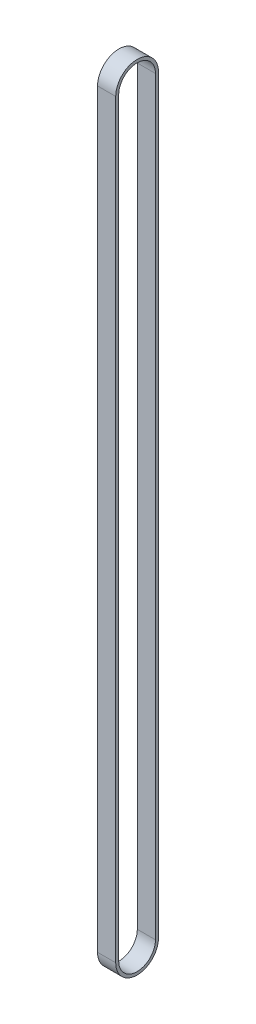
ISO-10303-21;
HEADER;
FILE_DESCRIPTION(('STEP AP214'),'2;1');
FILE_NAME('part.step','',(''),(''),'','','');
FILE_SCHEMA(('AUTOMOTIVE_DESIGN { 1 0 10303 214 1 1 1 1 }'));
ENDSEC;
DATA;
#1=APPLICATION_CONTEXT('core data for automotive mechanical design processes');
#2=APPLICATION_PROTOCOL_DEFINITION('international standard','automotive_design',2000,#1);
#3=PRODUCT_CONTEXT('',#1,'mechanical');
#4=PRODUCT('Part','Part','',(#3));
#5=PRODUCT_RELATED_PRODUCT_CATEGORY('part','',(#4));
#6=PRODUCT_DEFINITION_FORMATION('','',#4);
#7=PRODUCT_DEFINITION_CONTEXT('part definition',#1,'design');
#8=PRODUCT_DEFINITION('design','',#6,#7);
#9=PRODUCT_DEFINITION_SHAPE('','',#8);
#10=(LENGTH_UNIT() NAMED_UNIT(*) SI_UNIT(.MILLI.,.METRE.));
#11=(NAMED_UNIT(*) PLANE_ANGLE_UNIT() SI_UNIT($,.RADIAN.));
#12=(NAMED_UNIT(*) SI_UNIT($,.STERADIAN.) SOLID_ANGLE_UNIT());
#13=UNCERTAINTY_MEASURE_WITH_UNIT(LENGTH_MEASURE(1.E-05),#10,'distance_accuracy_value','');
#14=(GEOMETRIC_REPRESENTATION_CONTEXT(3) GLOBAL_UNCERTAINTY_ASSIGNED_CONTEXT((#13)) GLOBAL_UNIT_ASSIGNED_CONTEXT((#10,
#11,#12)) REPRESENTATION_CONTEXT('',''));
#15=CARTESIAN_POINT('',(0.,0.,0.));
#16=DIRECTION('',(0.,0.,1.));
#17=DIRECTION('',(1.,0.,0.));
#18=AXIS2_PLACEMENT_3D('',#15,#16,#17);
#19=CARTESIAN_POINT('',(6.05,-125.,0.));
#20=DIRECTION('',(1.,0.,0.));
#21=DIRECTION('',(0.,0.,-1.));
#22=AXIS2_PLACEMENT_3D('',#19,#20,#21);
#23=PLANE('',#22);
#24=CARTESIAN_POINT('',(6.05,-125.,0.));
#25=DIRECTION('',(1.,0.,0.));
#26=DIRECTION('',(0.,0.,-1.));
#27=AXIS2_PLACEMENT_3D('',#24,#25,#26);
#28=CIRCLE('',#27,7.12500000000005);
#29=CARTESIAN_POINT('',(6.05,-125.,7.12500000000005));
#30=VERTEX_POINT('',#29);
#31=CARTESIAN_POINT('',(6.05,-125.,-7.12500000000005));
#32=VERTEX_POINT('',#31);
#33=EDGE_CURVE('E145',#30,#32,#28,.T.);
#34=ORIENTED_EDGE('',*,*,#33,.T.);
#35=DIRECTION('',(0.,1.,0.));
#36=VECTOR('',#35,1.);
#37=CARTESIAN_POINT('',(6.05,-125.,-7.12500000000005));
#38=LINE('',#37,#36);
#39=CARTESIAN_POINT('',(6.05,125.,-7.12499999999995));
#40=VERTEX_POINT('',#39);
#41=EDGE_CURVE('E150',#32,#40,#38,.T.);
#42=ORIENTED_EDGE('',*,*,#41,.T.);
#43=CARTESIAN_POINT('',(6.05,125.,0.));
#44=DIRECTION('',(1.,0.,0.));
#45=DIRECTION('',(0.,0.,-1.));
#46=AXIS2_PLACEMENT_3D('',#43,#44,#45);
#47=CIRCLE('',#46,7.125);
#48=CARTESIAN_POINT('',(6.05,125.,7.12500000000005));
#49=VERTEX_POINT('',#48);
#50=EDGE_CURVE('E147',#40,#49,#47,.T.);
#51=ORIENTED_EDGE('',*,*,#50,.T.);
#52=DIRECTION('',(0.,-1.,0.));
#53=VECTOR('',#52,1.);
#54=CARTESIAN_POINT('',(6.05,-125.,7.12500000000005));
#55=LINE('',#54,#53);
#56=EDGE_CURVE('E155',#49,#30,#55,.T.);
#57=ORIENTED_EDGE('',*,*,#56,.T.);
#58=EDGE_LOOP('',(#34,#42,#51,#57));
#59=FACE_BOUND('',#58,.T.);
#60=DIRECTION('',(0.,1.,0.));
#61=VECTOR('',#60,1.);
#62=CARTESIAN_POINT('',(6.05,-125.,-6.12500000000005));
#63=LINE('',#62,#61);
#64=CARTESIAN_POINT('',(6.05,-125.,-6.12500000000005));
#65=VERTEX_POINT('',#64);
#66=CARTESIAN_POINT('',(6.05,125.,-6.125));
#67=VERTEX_POINT('',#66);
#68=EDGE_CURVE('E118',#65,#67,#63,.T.);
#69=ORIENTED_EDGE('',*,*,#68,.F.);
#70=CARTESIAN_POINT('',(6.05,-125.,0.));
#71=DIRECTION('',(1.,0.,0.));
#72=DIRECTION('',(0.,0.,-1.));
#73=AXIS2_PLACEMENT_3D('',#70,#71,#72);
#74=CIRCLE('',#73,6.12500000000005);
#75=CARTESIAN_POINT('',(6.05,-125.,6.12500000000005));
#76=VERTEX_POINT('',#75);
#77=EDGE_CURVE('E107',#76,#65,#74,.T.);
#78=ORIENTED_EDGE('',*,*,#77,.F.);
#79=DIRECTION('',(0.,-1.,0.));
#80=VECTOR('',#79,1.);
#81=CARTESIAN_POINT('',(6.05,-125.,6.12500000000005));
#82=LINE('',#81,#80);
#83=CARTESIAN_POINT('',(6.05,125.,6.12500000000009));
#84=VERTEX_POINT('',#83);
#85=EDGE_CURVE('E128',#84,#76,#82,.T.);
#86=ORIENTED_EDGE('',*,*,#85,.F.);
#87=CARTESIAN_POINT('',(6.05,125.,0.));
#88=DIRECTION('',(1.,0.,0.));
#89=DIRECTION('',(0.,0.,-1.));
#90=AXIS2_PLACEMENT_3D('',#87,#88,#89);
#91=CIRCLE('',#90,6.12500000000005);
#92=EDGE_CURVE('E126',#67,#84,#91,.T.);
#93=ORIENTED_EDGE('',*,*,#92,.F.);
#94=EDGE_LOOP('',(#69,#78,#86,#93));
#95=FACE_BOUND('',#94,.T.);
#96=ADVANCED_FACE('F43',(#59,#95),#23,.T.);
#97=CARTESIAN_POINT('',(0.,-125.,0.));
#98=DIRECTION('',(1.,0.,0.));
#99=DIRECTION('',(0.,0.,-1.));
#100=AXIS2_PLACEMENT_3D('',#97,#98,#99);
#101=PLANE('',#100);
#102=CARTESIAN_POINT('',(0.,-125.,0.));
#103=DIRECTION('',(1.,0.,0.));
#104=DIRECTION('',(0.,0.,-1.));
#105=AXIS2_PLACEMENT_3D('',#102,#103,#104);
#106=CIRCLE('',#105,7.12500000000005);
#107=CARTESIAN_POINT('',(0.,-125.,7.12500000000005));
#108=VERTEX_POINT('',#107);
#109=CARTESIAN_POINT('',(0.,-125.,-7.12500000000005));
#110=VERTEX_POINT('',#109);
#111=EDGE_CURVE('E122',#108,#110,#106,.T.);
#112=ORIENTED_EDGE('',*,*,#111,.F.);
#113=DIRECTION('',(0.,-1.,0.));
#114=VECTOR('',#113,1.);
#115=CARTESIAN_POINT('',(0.,-125.,7.12500000000005));
#116=LINE('',#115,#114);
#117=CARTESIAN_POINT('',(0.,125.,7.12500000000005));
#118=VERTEX_POINT('',#117);
#119=EDGE_CURVE('E146',#118,#108,#116,.T.);
#120=ORIENTED_EDGE('',*,*,#119,.F.);
#121=CARTESIAN_POINT('',(0.,125.,0.));
#122=DIRECTION('',(1.,0.,0.));
#123=DIRECTION('',(0.,0.,-1.));
#124=AXIS2_PLACEMENT_3D('',#121,#122,#123);
#125=CIRCLE('',#124,7.125);
#126=CARTESIAN_POINT('',(0.,125.,-7.12499999999995));
#127=VERTEX_POINT('',#126);
#128=EDGE_CURVE('E157',#127,#118,#125,.T.);
#129=ORIENTED_EDGE('',*,*,#128,.F.);
#130=DIRECTION('',(0.,1.,0.));
#131=VECTOR('',#130,1.);
#132=CARTESIAN_POINT('',(0.,-125.,-7.12500000000005));
#133=LINE('',#132,#131);
#134=EDGE_CURVE('E160',#110,#127,#133,.T.);
#135=ORIENTED_EDGE('',*,*,#134,.F.);
#136=EDGE_LOOP('',(#112,#120,#129,#135));
#137=FACE_BOUND('',#136,.T.);
#138=CARTESIAN_POINT('',(0.,-125.,0.));
#139=DIRECTION('',(1.,0.,0.));
#140=DIRECTION('',(0.,0.,-1.));
#141=AXIS2_PLACEMENT_3D('',#138,#139,#140);
#142=CIRCLE('',#141,6.12500000000005);
#143=CARTESIAN_POINT('',(0.,-125.,6.12500000000005));
#144=VERTEX_POINT('',#143);
#145=CARTESIAN_POINT('',(0.,-125.,-6.12500000000005));
#146=VERTEX_POINT('',#145);
#147=EDGE_CURVE('E68',#144,#146,#142,.T.);
#148=ORIENTED_EDGE('',*,*,#147,.T.);
#149=DIRECTION('',(0.,1.,0.));
#150=VECTOR('',#149,1.);
#151=CARTESIAN_POINT('',(0.,-125.,-6.12500000000005));
#152=LINE('',#151,#150);
#153=CARTESIAN_POINT('',(0.,125.,-6.125));
#154=VERTEX_POINT('',#153);
#155=EDGE_CURVE('E121',#146,#154,#152,.T.);
#156=ORIENTED_EDGE('',*,*,#155,.T.);
#157=CARTESIAN_POINT('',(0.,125.,0.));
#158=DIRECTION('',(1.,0.,0.));
#159=DIRECTION('',(0.,0.,-1.));
#160=AXIS2_PLACEMENT_3D('',#157,#158,#159);
#161=CIRCLE('',#160,6.12500000000005);
#162=CARTESIAN_POINT('',(0.,125.,6.12500000000009));
#163=VERTEX_POINT('',#162);
#164=EDGE_CURVE('E138',#154,#163,#161,.T.);
#165=ORIENTED_EDGE('',*,*,#164,.T.);
#166=DIRECTION('',(0.,-1.,0.));
#167=VECTOR('',#166,1.);
#168=CARTESIAN_POINT('',(0.,-125.,6.12500000000005));
#169=LINE('',#168,#167);
#170=EDGE_CURVE('E119',#163,#144,#169,.T.);
#171=ORIENTED_EDGE('',*,*,#170,.T.);
#172=EDGE_LOOP('',(#148,#156,#165,#171));
#173=FACE_BOUND('',#172,.T.);
#174=ADVANCED_FACE('F180',(#137,#173),#101,.F.);
#175=CARTESIAN_POINT('',(6.05,-125.,0.));
#176=DIRECTION('',(-1.,0.,0.));
#177=DIRECTION('',(0.,0.,1.));
#178=AXIS2_PLACEMENT_3D('',#175,#176,#177);
#179=CYLINDRICAL_SURFACE('',#178,7.12500000000005);
#180=ORIENTED_EDGE('',*,*,#111,.T.);
#181=DIRECTION('',(-1.,0.,0.));
#182=VECTOR('',#181,1.);
#183=CARTESIAN_POINT('',(6.05,-125.,-7.12500000000005));
#184=LINE('',#183,#182);
#185=EDGE_CURVE('E11',#32,#110,#184,.T.);
#186=ORIENTED_EDGE('',*,*,#185,.F.);
#187=ORIENTED_EDGE('',*,*,#33,.F.);
#188=DIRECTION('',(-1.,0.,0.));
#189=VECTOR('',#188,1.);
#190=CARTESIAN_POINT('',(6.05,-125.,7.12500000000005));
#191=LINE('',#190,#189);
#192=EDGE_CURVE('E152',#30,#108,#191,.T.);
#193=ORIENTED_EDGE('',*,*,#192,.T.);
#194=EDGE_LOOP('',(#180,#186,#187,#193));
#195=FACE_BOUND('',#194,.T.);
#196=ADVANCED_FACE('F44',(#195),#179,.T.);
#197=CARTESIAN_POINT('',(6.05,-125.,-7.12500000000005));
#198=DIRECTION('',(0.,0.,1.));
#199=DIRECTION('',(0.,-1.,0.));
#200=AXIS2_PLACEMENT_3D('',#197,#198,#199);
#201=PLANE('',#200);
#202=ORIENTED_EDGE('',*,*,#134,.T.);
#203=DIRECTION('',(-1.,0.,0.));
#204=VECTOR('',#203,1.);
#205=CARTESIAN_POINT('',(6.05,125.,-7.12499999999995));
#206=LINE('',#205,#204);
#207=EDGE_CURVE('E51',#40,#127,#206,.T.);
#208=ORIENTED_EDGE('',*,*,#207,.F.);
#209=ORIENTED_EDGE('',*,*,#41,.F.);
#210=ORIENTED_EDGE('',*,*,#185,.T.);
#211=EDGE_LOOP('',(#202,#208,#209,#210));
#212=FACE_BOUND('',#211,.T.);
#213=ADVANCED_FACE('F189',(#212),#201,.F.);
#214=CARTESIAN_POINT('',(6.05,125.,0.));
#215=DIRECTION('',(-1.,0.,0.));
#216=DIRECTION('',(0.,0.,1.));
#217=AXIS2_PLACEMENT_3D('',#214,#215,#216);
#218=CYLINDRICAL_SURFACE('',#217,7.125);
#219=ORIENTED_EDGE('',*,*,#128,.T.);
#220=DIRECTION('',(-1.,0.,0.));
#221=VECTOR('',#220,1.);
#222=CARTESIAN_POINT('',(6.05,125.,7.12500000000005));
#223=LINE('',#222,#221);
#224=EDGE_CURVE('E163',#49,#118,#223,.T.);
#225=ORIENTED_EDGE('',*,*,#224,.F.);
#226=ORIENTED_EDGE('',*,*,#50,.F.);
#227=ORIENTED_EDGE('',*,*,#207,.T.);
#228=EDGE_LOOP('',(#219,#225,#226,#227));
#229=FACE_BOUND('',#228,.T.);
#230=ADVANCED_FACE('F173',(#229),#218,.T.);
#231=CARTESIAN_POINT('',(6.05,-125.,7.12500000000005));
#232=DIRECTION('',(0.,0.,-1.));
#233=DIRECTION('',(-1.,0.,0.));
#234=AXIS2_PLACEMENT_3D('',#231,#232,#233);
#235=PLANE('',#234);
#236=ORIENTED_EDGE('',*,*,#119,.T.);
#237=ORIENTED_EDGE('',*,*,#192,.F.);
#238=ORIENTED_EDGE('',*,*,#56,.F.);
#239=ORIENTED_EDGE('',*,*,#224,.T.);
#240=EDGE_LOOP('',(#236,#237,#238,#239));
#241=FACE_BOUND('',#240,.T.);
#242=ADVANCED_FACE('F182',(#241),#235,.F.);
#243=CARTESIAN_POINT('',(6.05,-125.,0.));
#244=DIRECTION('',(-1.,0.,0.));
#245=DIRECTION('',(0.,0.,1.));
#246=AXIS2_PLACEMENT_3D('',#243,#244,#245);
#247=CYLINDRICAL_SURFACE('',#246,6.12500000000005);
#248=ORIENTED_EDGE('',*,*,#147,.F.);
#249=DIRECTION('',(-1.,0.,0.));
#250=VECTOR('',#249,1.);
#251=CARTESIAN_POINT('',(6.05,-125.,6.12500000000005));
#252=LINE('',#251,#250);
#253=EDGE_CURVE('E115',#76,#144,#252,.T.);
#254=ORIENTED_EDGE('',*,*,#253,.F.);
#255=ORIENTED_EDGE('',*,*,#77,.T.);
#256=DIRECTION('',(-1.,0.,0.));
#257=VECTOR('',#256,1.);
#258=CARTESIAN_POINT('',(6.05,-125.,-6.12500000000005));
#259=LINE('',#258,#257);
#260=EDGE_CURVE('E112',#65,#146,#259,.T.);
#261=ORIENTED_EDGE('',*,*,#260,.T.);
#262=EDGE_LOOP('',(#248,#254,#255,#261));
#263=FACE_BOUND('',#262,.T.);
#264=ADVANCED_FACE('F109',(#263),#247,.F.);
#265=CARTESIAN_POINT('',(6.05,-125.,-6.12500000000005));
#266=DIRECTION('',(0.,0.,1.));
#267=DIRECTION('',(0.,-1.,0.));
#268=AXIS2_PLACEMENT_3D('',#265,#266,#267);
#269=PLANE('',#268);
#270=ORIENTED_EDGE('',*,*,#155,.F.);
#271=ORIENTED_EDGE('',*,*,#260,.F.);
#272=ORIENTED_EDGE('',*,*,#68,.T.);
#273=DIRECTION('',(-1.,0.,0.));
#274=VECTOR('',#273,1.);
#275=CARTESIAN_POINT('',(6.05,125.,-6.125));
#276=LINE('',#275,#274);
#277=EDGE_CURVE('E124',#67,#154,#276,.T.);
#278=ORIENTED_EDGE('',*,*,#277,.T.);
#279=EDGE_LOOP('',(#270,#271,#272,#278));
#280=FACE_BOUND('',#279,.T.);
#281=ADVANCED_FACE('F116',(#280),#269,.T.);
#282=CARTESIAN_POINT('',(6.05,125.,0.));
#283=DIRECTION('',(-1.,0.,0.));
#284=DIRECTION('',(0.,0.,1.));
#285=AXIS2_PLACEMENT_3D('',#282,#283,#284);
#286=CYLINDRICAL_SURFACE('',#285,6.12500000000005);
#287=ORIENTED_EDGE('',*,*,#164,.F.);
#288=ORIENTED_EDGE('',*,*,#277,.F.);
#289=ORIENTED_EDGE('',*,*,#92,.T.);
#290=DIRECTION('',(-1.,0.,0.));
#291=VECTOR('',#290,1.);
#292=CARTESIAN_POINT('',(6.05,125.,6.12500000000009));
#293=LINE('',#292,#291);
#294=EDGE_CURVE('E59',#84,#163,#293,.T.);
#295=ORIENTED_EDGE('',*,*,#294,.T.);
#296=EDGE_LOOP('',(#287,#288,#289,#295));
#297=FACE_BOUND('',#296,.T.);
#298=ADVANCED_FACE('F209',(#297),#286,.F.);
#299=CARTESIAN_POINT('',(6.05,-125.,6.12500000000005));
#300=DIRECTION('',(0.,0.,-1.));
#301=DIRECTION('',(0.,1.,0.));
#302=AXIS2_PLACEMENT_3D('',#299,#300,#301);
#303=PLANE('',#302);
#304=ORIENTED_EDGE('',*,*,#170,.F.);
#305=ORIENTED_EDGE('',*,*,#294,.F.);
#306=ORIENTED_EDGE('',*,*,#85,.T.);
#307=ORIENTED_EDGE('',*,*,#253,.T.);
#308=EDGE_LOOP('',(#304,#305,#306,#307));
#309=FACE_BOUND('',#308,.T.);
#310=ADVANCED_FACE('F212',(#309),#303,.T.);
#311=CLOSED_SHELL('',(#96,#174,#196,#213,#230,#242,#264,#281,#298,#310));
#312=MANIFOLD_SOLID_BREP('B2',#311);
#313=ADVANCED_BREP_SHAPE_REPRESENTATION('',(#18,#312),#14);
#314=SHAPE_DEFINITION_REPRESENTATION(#9,#313);
ENDSEC;
END-ISO-10303-21;
